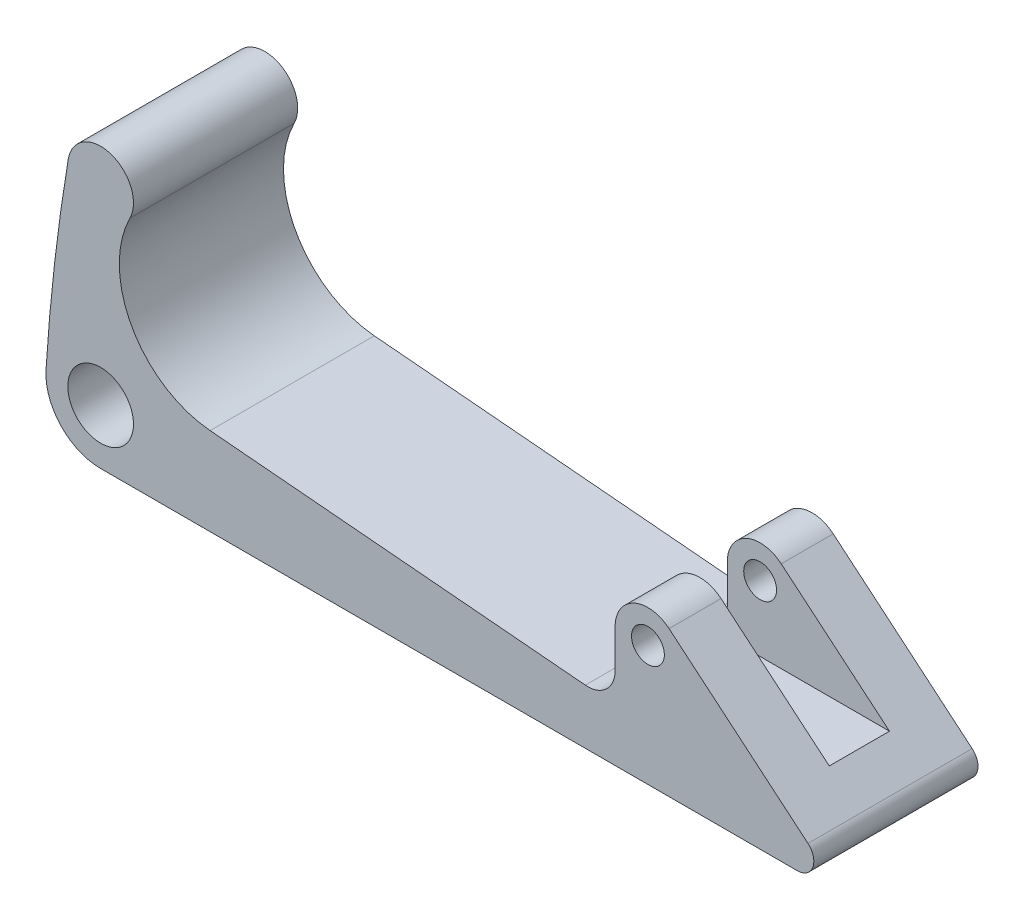
ISO-10303-21;
HEADER;
FILE_DESCRIPTION(('STEP AP214'),'2;1');
FILE_NAME('part.step','',(''),(''),'','','');
FILE_SCHEMA(('AUTOMOTIVE_DESIGN { 1 0 10303 214 1 1 1 1 }'));
ENDSEC;
DATA;
#1=APPLICATION_CONTEXT('core data for automotive mechanical design processes');
#2=APPLICATION_PROTOCOL_DEFINITION('international standard','automotive_design',2000,#1);
#3=PRODUCT_CONTEXT('',#1,'mechanical');
#4=PRODUCT('Part','Part','',(#3));
#5=PRODUCT_RELATED_PRODUCT_CATEGORY('part','',(#4));
#6=PRODUCT_DEFINITION_FORMATION('','',#4);
#7=PRODUCT_DEFINITION_CONTEXT('part definition',#1,'design');
#8=PRODUCT_DEFINITION('design','',#6,#7);
#9=PRODUCT_DEFINITION_SHAPE('','',#8);
#10=(LENGTH_UNIT() NAMED_UNIT(*) SI_UNIT(.MILLI.,.METRE.));
#11=(NAMED_UNIT(*) PLANE_ANGLE_UNIT() SI_UNIT($,.RADIAN.));
#12=(NAMED_UNIT(*) SI_UNIT($,.STERADIAN.) SOLID_ANGLE_UNIT());
#13=UNCERTAINTY_MEASURE_WITH_UNIT(LENGTH_MEASURE(1.E-05),#10,'distance_accuracy_value','');
#14=(GEOMETRIC_REPRESENTATION_CONTEXT(3) GLOBAL_UNCERTAINTY_ASSIGNED_CONTEXT((#13)) GLOBAL_UNIT_ASSIGNED_CONTEXT((#10,
#11,#12)) REPRESENTATION_CONTEXT('',''));
#15=CARTESIAN_POINT('',(0.,0.,0.));
#16=DIRECTION('',(0.,0.,1.));
#17=DIRECTION('',(1.,0.,0.));
#18=AXIS2_PLACEMENT_3D('',#15,#16,#17);
#19=CARTESIAN_POINT('',(64.6194262844656,-2.35093333532153,7.5));
#20=DIRECTION('',(-0.642787609686535,-0.766044443118982,0.));
#21=DIRECTION('',(0.766044443118982,-0.642787609686535,0.));
#22=AXIS2_PLACEMENT_3D('',#19,#20,#21);
#23=PLANE('',#22);
#24=DIRECTION('',(-0.766044443118982,0.642787609686535,0.));
#25=VECTOR('',#24,1.);
#26=CARTESIAN_POINT('',(41.4326190039493,17.1051081019381,2.75));
#27=LINE('',#26,#25);
#28=CARTESIAN_POINT('',(61.8176930361466,0.,2.75));
#29=VERTEX_POINT('',#28);
#30=CARTESIAN_POINT('',(51.9283628290596,8.29813332935695,2.75));
#31=VERTEX_POINT('',#30);
#32=EDGE_CURVE('E339',#29,#31,#27,.T.);
#33=ORIENTED_EDGE('',*,*,#32,.T.);
#34=DIRECTION('',(0.,0.,-1.));
#35=VECTOR('',#34,1.);
#36=CARTESIAN_POINT('',(51.9283628290596,8.29813332935695,7.5));
#37=LINE('',#36,#35);
#38=CARTESIAN_POINT('',(51.9283628290596,8.29813332935695,7.5));
#39=VERTEX_POINT('',#38);
#40=EDGE_CURVE('E211',#39,#31,#37,.T.);
#41=ORIENTED_EDGE('',*,*,#40,.F.);
#42=DIRECTION('',(-0.766044443118982,0.642787609686535,0.));
#43=VECTOR('',#42,1.);
#44=CARTESIAN_POINT('',(64.6194262844656,-2.35093333532153,7.5));
#45=LINE('',#44,#43);
#46=CARTESIAN_POINT('',(64.6194262844656,-2.35093333532153,7.5));
#47=VERTEX_POINT('',#46);
#48=EDGE_CURVE('E297',#47,#39,#45,.T.);
#49=ORIENTED_EDGE('',*,*,#48,.F.);
#50=DIRECTION('',(0.,0.,-1.));
#51=VECTOR('',#50,1.);
#52=CARTESIAN_POINT('',(64.6194262844656,-2.35093333532153,7.5));
#53=LINE('',#52,#51);
#54=CARTESIAN_POINT('',(64.6194262844656,-2.35093333532153,-7.5));
#55=VERTEX_POINT('',#54);
#56=EDGE_CURVE('E214',#47,#55,#53,.T.);
#57=ORIENTED_EDGE('',*,*,#56,.T.);
#58=DIRECTION('',(-0.766044443118982,0.642787609686535,0.));
#59=VECTOR('',#58,1.);
#60=CARTESIAN_POINT('',(64.6194262844656,-2.35093333532153,-7.5));
#61=LINE('',#60,#59);
#62=CARTESIAN_POINT('',(51.9283628290596,8.29813332935695,-7.5));
#63=VERTEX_POINT('',#62);
#64=EDGE_CURVE('E238',#55,#63,#61,.T.);
#65=ORIENTED_EDGE('',*,*,#64,.T.);
#66=CARTESIAN_POINT('',(51.9283628290596,8.29813332935695,-2.75));
#67=VERTEX_POINT('',#66);
#68=EDGE_CURVE('E210',#67,#63,#37,.T.);
#69=ORIENTED_EDGE('',*,*,#68,.F.);
#70=DIRECTION('',(-0.766044443118982,0.642787609686535,0.));
#71=VECTOR('',#70,1.);
#72=CARTESIAN_POINT('',(41.4326190039493,17.1051081019381,-2.75));
#73=LINE('',#72,#71);
#74=CARTESIAN_POINT('',(61.8176930361466,0.,-2.75));
#75=VERTEX_POINT('',#74);
#76=EDGE_CURVE('E321',#75,#67,#73,.T.);
#77=ORIENTED_EDGE('',*,*,#76,.F.);
#78=DIRECTION('',(0.,0.,1.));
#79=VECTOR('',#78,1.);
#80=CARTESIAN_POINT('',(61.8176930361466,0.,0.));
#81=LINE('',#80,#79);
#82=EDGE_CURVE('E330',#75,#29,#81,.T.);
#83=ORIENTED_EDGE('',*,*,#82,.T.);
#84=EDGE_LOOP('',(#33,#41,#49,#57,#65,#69,#77,#83));
#85=FACE_BOUND('',#84,.T.);
#86=ADVANCED_FACE('F34',(#85),#23,.F.);
#87=CARTESIAN_POINT('',(50.,6.,7.5));
#88=DIRECTION('',(0.,0.,-1.));
#89=DIRECTION('',(-1.,0.,0.));
#90=AXIS2_PLACEMENT_3D('',#87,#88,#89);
#91=CYLINDRICAL_SURFACE('',#90,3.);
#92=CARTESIAN_POINT('',(50.,6.,2.75));
#93=DIRECTION('',(0.,0.,-1.));
#94=DIRECTION('',(-1.,0.,0.));
#95=AXIS2_PLACEMENT_3D('',#92,#93,#94);
#96=CIRCLE('',#95,3.);
#97=CARTESIAN_POINT('',(47.,6.,2.75));
#98=VERTEX_POINT('',#97);
#99=EDGE_CURVE('E336',#31,#98,#96,.F.);
#100=ORIENTED_EDGE('',*,*,#99,.T.);
#101=DIRECTION('',(0.,0.,-1.));
#102=VECTOR('',#101,1.);
#103=CARTESIAN_POINT('',(47.,6.,7.5));
#104=LINE('',#103,#102);
#105=CARTESIAN_POINT('',(47.,6.,7.5));
#106=VERTEX_POINT('',#105);
#107=EDGE_CURVE('E207',#106,#98,#104,.T.);
#108=ORIENTED_EDGE('',*,*,#107,.F.);
#109=CARTESIAN_POINT('',(50.,6.,7.5));
#110=DIRECTION('',(0.,0.,1.));
#111=DIRECTION('',(1.,0.,0.));
#112=AXIS2_PLACEMENT_3D('',#109,#110,#111);
#113=CIRCLE('',#112,3.);
#114=EDGE_CURVE('E299',#39,#106,#113,.T.);
#115=ORIENTED_EDGE('',*,*,#114,.F.);
#116=ORIENTED_EDGE('',*,*,#40,.T.);
#117=EDGE_LOOP('',(#100,#108,#115,#116));
#118=FACE_BOUND('',#117,.T.);
#119=ADVANCED_FACE('F394',(#118),#91,.T.);
#120=CARTESIAN_POINT('',(47.,6.,7.5));
#121=DIRECTION('',(1.,0.,0.));
#122=DIRECTION('',(0.,1.,0.));
#123=AXIS2_PLACEMENT_3D('',#120,#121,#122);
#124=PLANE('',#123);
#125=DIRECTION('',(0.,-1.,0.));
#126=VECTOR('',#125,1.);
#127=CARTESIAN_POINT('',(47.,20.501,2.75));
#128=LINE('',#127,#126);
#129=CARTESIAN_POINT('',(47.,2.49119070221423,2.75));
#130=VERTEX_POINT('',#129);
#131=EDGE_CURVE('E340',#98,#130,#128,.T.);
#132=ORIENTED_EDGE('',*,*,#131,.T.);
#133=DIRECTION('',(0.,0.,-1.));
#134=VECTOR('',#133,1.);
#135=CARTESIAN_POINT('',(47.,2.49119070221423,7.5));
#136=LINE('',#135,#134);
#137=CARTESIAN_POINT('',(47.,2.49119070221423,7.5));
#138=VERTEX_POINT('',#137);
#139=EDGE_CURVE('E199',#138,#130,#136,.T.);
#140=ORIENTED_EDGE('',*,*,#139,.F.);
#141=DIRECTION('',(0.,-1.,0.));
#142=VECTOR('',#141,1.);
#143=CARTESIAN_POINT('',(47.,6.,7.5));
#144=LINE('',#143,#142);
#145=EDGE_CURVE('E301',#106,#138,#144,.T.);
#146=ORIENTED_EDGE('',*,*,#145,.F.);
#147=ORIENTED_EDGE('',*,*,#107,.T.);
#148=EDGE_LOOP('',(#132,#140,#146,#147));
#149=FACE_BOUND('',#148,.T.);
#150=ADVANCED_FACE('F399',(#149),#124,.F.);
#151=CARTESIAN_POINT('',(44.5,2.49119070221423,7.5));
#152=DIRECTION('',(0.,0.,-1.));
#153=DIRECTION('',(-1.,0.,0.));
#154=AXIS2_PLACEMENT_3D('',#151,#152,#153);
#155=CYLINDRICAL_SURFACE('',#154,2.5);
#156=DIRECTION('',(0.,0.,-1.));
#157=VECTOR('',#156,1.);
#158=CARTESIAN_POINT('',(44.2821106431309,0.000703956984865386,7.5));
#159=LINE('',#158,#157);
#160=CARTESIAN_POINT('',(44.2821106431309,0.000703956984865386,-2.75));
#161=VERTEX_POINT('',#160);
#162=CARTESIAN_POINT('',(44.2821106431309,0.000703956984865386,-7.5));
#163=VERTEX_POINT('',#162);
#164=EDGE_CURVE('E197',#161,#163,#159,.T.);
#165=ORIENTED_EDGE('',*,*,#164,.F.);
#166=CARTESIAN_POINT('',(44.5,2.49119070221423,-2.75));
#167=DIRECTION('',(0.,0.,-1.));
#168=DIRECTION('',(-1.,0.,0.));
#169=AXIS2_PLACEMENT_3D('',#166,#167,#168);
#170=CIRCLE('',#169,2.5);
#171=CARTESIAN_POINT('',(44.2903124104736,0.,-2.75));
#172=VERTEX_POINT('',#171);
#173=EDGE_CURVE('E170',#172,#161,#170,.T.);
#174=ORIENTED_EDGE('',*,*,#173,.F.);
#175=DIRECTION('',(0.,0.,-1.));
#176=VECTOR('',#175,1.);
#177=CARTESIAN_POINT('',(44.2903124104736,0.,7.5));
#178=LINE('',#177,#176);
#179=CARTESIAN_POINT('',(44.2903124104736,0.,2.75));
#180=VERTEX_POINT('',#179);
#181=EDGE_CURVE('E180',#172,#180,#178,.F.);
#182=ORIENTED_EDGE('',*,*,#181,.T.);
#183=CARTESIAN_POINT('',(44.5,2.49119070221423,2.75));
#184=DIRECTION('',(0.,0.,-1.));
#185=DIRECTION('',(-1.,0.,0.));
#186=AXIS2_PLACEMENT_3D('',#183,#184,#185);
#187=CIRCLE('',#186,2.5);
#188=CARTESIAN_POINT('',(44.2821106431309,0.000703956984865386,2.75));
#189=VERTEX_POINT('',#188);
#190=EDGE_CURVE('E176',#180,#189,#187,.T.);
#191=ORIENTED_EDGE('',*,*,#190,.T.);
#192=CARTESIAN_POINT('',(44.2821106431309,0.000703956984865386,7.5));
#193=VERTEX_POINT('',#192);
#194=EDGE_CURVE('E188',#193,#189,#159,.T.);
#195=ORIENTED_EDGE('',*,*,#194,.F.);
#196=CARTESIAN_POINT('',(44.5,2.49119070221423,7.5));
#197=DIRECTION('',(0.,0.,-1.));
#198=DIRECTION('',(-1.,0.,0.));
#199=AXIS2_PLACEMENT_3D('',#196,#197,#198);
#200=CIRCLE('',#199,2.5);
#201=EDGE_CURVE('E303',#138,#193,#200,.T.);
#202=ORIENTED_EDGE('',*,*,#201,.F.);
#203=ORIENTED_EDGE('',*,*,#139,.T.);
#204=CARTESIAN_POINT('',(44.5,2.49119070221423,2.75));
#205=DIRECTION('',(0.,0.,-1.));
#206=DIRECTION('',(-1.,0.,0.));
#207=AXIS2_PLACEMENT_3D('',#204,#205,#206);
#208=CIRCLE('',#207,2.5);
#209=CARTESIAN_POINT('',(44.7096875895264,0.,2.75));
#210=VERTEX_POINT('',#209);
#211=EDGE_CURVE('E329',#130,#210,#208,.T.);
#212=ORIENTED_EDGE('',*,*,#211,.T.);
#213=DIRECTION('',(0.,0.,-1.));
#214=VECTOR('',#213,1.);
#215=CARTESIAN_POINT('',(44.7096875895264,0.,7.5));
#216=LINE('',#215,#214);
#217=CARTESIAN_POINT('',(44.7096875895264,0.,-2.75));
#218=VERTEX_POINT('',#217);
#219=EDGE_CURVE('E333',#210,#218,#216,.T.);
#220=ORIENTED_EDGE('',*,*,#219,.T.);
#221=CARTESIAN_POINT('',(44.5,2.49119070221423,-2.75));
#222=DIRECTION('',(0.,0.,-1.));
#223=DIRECTION('',(-1.,0.,0.));
#224=AXIS2_PLACEMENT_3D('',#221,#222,#223);
#225=CIRCLE('',#224,2.5);
#226=CARTESIAN_POINT('',(47.,2.49119070221423,-2.75));
#227=VERTEX_POINT('',#226);
#228=EDGE_CURVE('E325',#227,#218,#225,.T.);
#229=ORIENTED_EDGE('',*,*,#228,.F.);
#230=CARTESIAN_POINT('',(47.,2.49119070221423,-7.5));
#231=VERTEX_POINT('',#230);
#232=EDGE_CURVE('E196',#227,#231,#136,.T.);
#233=ORIENTED_EDGE('',*,*,#232,.T.);
#234=CARTESIAN_POINT('',(44.5,2.49119070221423,-7.5));
#235=DIRECTION('',(0.,0.,-1.));
#236=DIRECTION('',(-1.,0.,0.));
#237=AXIS2_PLACEMENT_3D('',#234,#235,#236);
#238=CIRCLE('',#237,2.5);
#239=EDGE_CURVE('E252',#231,#163,#238,.T.);
#240=ORIENTED_EDGE('',*,*,#239,.T.);
#241=EDGE_LOOP('',(#165,#174,#182,#191,#195,#202,#203,#212,#220,#229,#233,#240));
#242=FACE_BOUND('',#241,.T.);
#243=ADVANCED_FACE('F186',(#242),#155,.F.);
#244=CARTESIAN_POINT('',(50.,6.,7.5));
#245=DIRECTION('',(0.,0.,-1.));
#246=DIRECTION('',(-1.,0.,0.));
#247=AXIS2_PLACEMENT_3D('',#244,#245,#246);
#248=CYLINDRICAL_SURFACE('',#247,1.5);
#249=CARTESIAN_POINT('',(50.,6.,7.5));
#250=DIRECTION('',(0.,0.,1.));
#251=DIRECTION('',(1.,0.,0.));
#252=AXIS2_PLACEMENT_3D('',#249,#250,#251);
#253=CIRCLE('',#252,1.5);
#254=CARTESIAN_POINT('',(51.5,6.,7.5));
#255=VERTEX_POINT('',#254);
#256=EDGE_CURVE('E312',#255,#255,#253,.T.);
#257=ORIENTED_EDGE('',*,*,#256,.T.);
#258=EDGE_LOOP('',(#257));
#259=FACE_BOUND('',#258,.T.);
#260=CARTESIAN_POINT('',(50.,6.,2.75));
#261=DIRECTION('',(0.,0.,-1.));
#262=DIRECTION('',(-1.,0.,0.));
#263=AXIS2_PLACEMENT_3D('',#260,#261,#262);
#264=CIRCLE('',#263,1.5);
#265=CARTESIAN_POINT('',(48.5,6.,2.75));
#266=VERTEX_POINT('',#265);
#267=EDGE_CURVE('E322',#266,#266,#264,.F.);
#268=ORIENTED_EDGE('',*,*,#267,.F.);
#269=EDGE_LOOP('',(#268));
#270=FACE_BOUND('',#269,.T.);
#271=ADVANCED_FACE('F421',(#259,#270),#248,.F.);
#272=CARTESIAN_POINT('',(164.683096879914,-10.2214285714286,7.5));
#273=DIRECTION('',(0.,0.,-1.));
#274=DIRECTION('',(-1.,0.,0.));
#275=AXIS2_PLACEMENT_3D('',#272,#273,#274);
#276=PLANE('',#275);
#277=CARTESIAN_POINT('',(164.683096879914,-10.2214285714286,7.5));
#278=DIRECTION('',(0.,0.,1.));
#279=DIRECTION('',(-1.,0.,0.));
#280=AXIS2_PLACEMENT_3D('',#277,#278,#279);
#281=CIRCLE('',#280,170.);
#282=CARTESIAN_POINT('',(-2.95837898586672,17.9979897348161,7.5));
#283=VERTEX_POINT('',#282);
#284=CARTESIAN_POINT('',(-4.9903968751489,0.30974025974026,7.5));
#285=VERTEX_POINT('',#284);
#286=EDGE_CURVE('E261',#283,#285,#281,.T.);
#287=ORIENTED_EDGE('',*,*,#286,.T.);
#288=CARTESIAN_POINT('',(0.,0.,7.5));
#289=DIRECTION('',(0.,0.,1.));
#290=DIRECTION('',(-1.,0.,0.));
#291=AXIS2_PLACEMENT_3D('',#288,#289,#290);
#292=CIRCLE('',#291,4.99999999999999);
#293=CARTESIAN_POINT('',(0.,-5.,7.5));
#294=VERTEX_POINT('',#293);
#295=EDGE_CURVE('E287',#285,#294,#292,.T.);
#296=ORIENTED_EDGE('',*,*,#295,.T.);
#297=DIRECTION('',(1.,0.,0.));
#298=VECTOR('',#297,1.);
#299=CARTESIAN_POINT('',(0.,-5.,7.5));
#300=LINE('',#299,#298);
#301=CARTESIAN_POINT('',(63.6552448699358,-5.,7.5));
#302=VERTEX_POINT('',#301);
#303=EDGE_CURVE('E227',#294,#302,#300,.T.);
#304=ORIENTED_EDGE('',*,*,#303,.T.);
#305=CARTESIAN_POINT('',(63.6552448699358,-3.5,7.5));
#306=DIRECTION('',(0.,0.,1.));
#307=DIRECTION('',(1.,0.,0.));
#308=AXIS2_PLACEMENT_3D('',#305,#306,#307);
#309=CIRCLE('',#308,1.5);
#310=EDGE_CURVE('E295',#302,#47,#309,.T.);
#311=ORIENTED_EDGE('',*,*,#310,.T.);
#312=ORIENTED_EDGE('',*,*,#48,.T.);
#313=ORIENTED_EDGE('',*,*,#114,.T.);
#314=ORIENTED_EDGE('',*,*,#145,.T.);
#315=ORIENTED_EDGE('',*,*,#201,.T.);
#316=DIRECTION('',(-0.996194698091746,0.0871557427476512,0.));
#317=VECTOR('',#316,1.);
#318=CARTESIAN_POINT('',(44.2821106431309,0.000703956984865386,7.5));
#319=LINE('',#318,#317);
#320=CARTESIAN_POINT('',(10.,3.,7.5));
#321=VERTEX_POINT('',#320);
#322=EDGE_CURVE('E195',#193,#321,#319,.T.);
#323=ORIENTED_EDGE('',*,*,#322,.T.);
#324=CARTESIAN_POINT('',(10.7921090503872,12.0538478754167,7.5));
#325=DIRECTION('',(0.,0.,-1.));
#326=DIRECTION('',(1.,0.,0.));
#327=AXIS2_PLACEMENT_3D('',#324,#325,#326);
#328=CIRCLE('',#327,9.088432103443);
#329=CARTESIAN_POINT('',(2.67829002753302,16.1484222077819,7.5));
#330=VERTEX_POINT('',#329);
#331=EDGE_CURVE('E276',#321,#330,#328,.T.);
#332=ORIENTED_EDGE('',*,*,#331,.T.);
#333=CARTESIAN_POINT('',(0.,17.5,7.5));
#334=DIRECTION('',(0.,0.,1.));
#335=DIRECTION('',(-1.,0.,0.));
#336=AXIS2_PLACEMENT_3D('',#333,#334,#335);
#337=CIRCLE('',#336,2.99999999999999);
#338=EDGE_CURVE('E265',#330,#283,#337,.T.);
#339=ORIENTED_EDGE('',*,*,#338,.T.);
#340=EDGE_LOOP('',(#287,#296,#304,#311,#312,#313,#314,#315,#323,#332,#339));
#341=FACE_BOUND('',#340,.T.);
#342=CARTESIAN_POINT('',(0.,0.,7.5));
#343=DIRECTION('',(0.,0.,1.));
#344=DIRECTION('',(1.,0.,0.));
#345=AXIS2_PLACEMENT_3D('',#342,#343,#344);
#346=CIRCLE('',#345,3.);
#347=CARTESIAN_POINT('',(3.,0.,7.5));
#348=VERTEX_POINT('',#347);
#349=EDGE_CURVE('E307',#348,#348,#346,.T.);
#350=ORIENTED_EDGE('',*,*,#349,.F.);
#351=EDGE_LOOP('',(#350));
#352=FACE_BOUND('',#351,.T.);
#353=ORIENTED_EDGE('',*,*,#256,.F.);
#354=EDGE_LOOP('',(#353));
#355=FACE_BOUND('',#354,.T.);
#356=ADVANCED_FACE('F384',(#341,#352,#355),#276,.F.);
#357=CARTESIAN_POINT('',(164.683096879914,-10.2214285714286,-7.5));
#358=DIRECTION('',(0.,0.,-1.));
#359=DIRECTION('',(-1.,0.,0.));
#360=AXIS2_PLACEMENT_3D('',#357,#358,#359);
#361=PLANE('',#360);
#362=CARTESIAN_POINT('',(0.,0.,-7.5));
#363=DIRECTION('',(0.,0.,1.));
#364=DIRECTION('',(1.,0.,0.));
#365=AXIS2_PLACEMENT_3D('',#362,#363,#364);
#366=CIRCLE('',#365,3.);
#367=CARTESIAN_POINT('',(3.,0.,-7.5));
#368=VERTEX_POINT('',#367);
#369=EDGE_CURVE('E291',#368,#368,#366,.T.);
#370=ORIENTED_EDGE('',*,*,#369,.T.);
#371=EDGE_LOOP('',(#370));
#372=FACE_BOUND('',#371,.T.);
#373=CARTESIAN_POINT('',(164.683096879914,-10.2214285714286,-7.5));
#374=DIRECTION('',(0.,0.,1.));
#375=DIRECTION('',(-1.,0.,0.));
#376=AXIS2_PLACEMENT_3D('',#373,#374,#375);
#377=CIRCLE('',#376,170.);
#378=CARTESIAN_POINT('',(-2.95837898586672,17.9979897348161,-7.5));
#379=VERTEX_POINT('',#378);
#380=CARTESIAN_POINT('',(-4.9903968751489,0.30974025974026,-7.5));
#381=VERTEX_POINT('',#380);
#382=EDGE_CURVE('E240',#379,#381,#377,.T.);
#383=ORIENTED_EDGE('',*,*,#382,.F.);
#384=CARTESIAN_POINT('',(0.,17.5,-7.5));
#385=DIRECTION('',(0.,0.,1.));
#386=DIRECTION('',(-1.,0.,0.));
#387=AXIS2_PLACEMENT_3D('',#384,#385,#386);
#388=CIRCLE('',#387,2.99999999999999);
#389=CARTESIAN_POINT('',(2.67829002753302,16.1484222077819,-7.5));
#390=VERTEX_POINT('',#389);
#391=EDGE_CURVE('E259',#390,#379,#388,.T.);
#392=ORIENTED_EDGE('',*,*,#391,.F.);
#393=CARTESIAN_POINT('',(10.7921090503872,12.0538478754167,-7.5));
#394=DIRECTION('',(0.,0.,-1.));
#395=DIRECTION('',(1.,0.,0.));
#396=AXIS2_PLACEMENT_3D('',#393,#394,#395);
#397=CIRCLE('',#396,9.088432103443);
#398=CARTESIAN_POINT('',(10.,3.,-7.5));
#399=VERTEX_POINT('',#398);
#400=EDGE_CURVE('E257',#399,#390,#397,.T.);
#401=ORIENTED_EDGE('',*,*,#400,.F.);
#402=DIRECTION('',(-0.996194698091746,0.0871557427476512,0.));
#403=VECTOR('',#402,1.);
#404=CARTESIAN_POINT('',(44.2821106431309,0.000703956984865386,-7.5));
#405=LINE('',#404,#403);
#406=EDGE_CURVE('E255',#163,#399,#405,.T.);
#407=ORIENTED_EDGE('',*,*,#406,.F.);
#408=ORIENTED_EDGE('',*,*,#239,.F.);
#409=DIRECTION('',(0.,-1.,0.));
#410=VECTOR('',#409,1.);
#411=CARTESIAN_POINT('',(47.,6.,-7.5));
#412=LINE('',#411,#410);
#413=CARTESIAN_POINT('',(47.,6.,-7.5));
#414=VERTEX_POINT('',#413);
#415=EDGE_CURVE('E249',#414,#231,#412,.T.);
#416=ORIENTED_EDGE('',*,*,#415,.F.);
#417=CARTESIAN_POINT('',(50.,6.,-7.5));
#418=DIRECTION('',(0.,0.,1.));
#419=DIRECTION('',(1.,0.,0.));
#420=AXIS2_PLACEMENT_3D('',#417,#418,#419);
#421=CIRCLE('',#420,3.);
#422=EDGE_CURVE('E246',#63,#414,#421,.T.);
#423=ORIENTED_EDGE('',*,*,#422,.F.);
#424=ORIENTED_EDGE('',*,*,#64,.F.);
#425=CARTESIAN_POINT('',(63.6552448699358,-3.5,-7.5));
#426=DIRECTION('',(0.,0.,1.));
#427=DIRECTION('',(1.,0.,0.));
#428=AXIS2_PLACEMENT_3D('',#425,#426,#427);
#429=CIRCLE('',#428,1.5);
#430=CARTESIAN_POINT('',(63.6552448699358,-5.,-7.5));
#431=VERTEX_POINT('',#430);
#432=EDGE_CURVE('E236',#431,#55,#429,.T.);
#433=ORIENTED_EDGE('',*,*,#432,.F.);
#434=DIRECTION('',(1.,0.,0.));
#435=VECTOR('',#434,1.);
#436=CARTESIAN_POINT('',(0.,-5.,-7.5));
#437=LINE('',#436,#435);
#438=CARTESIAN_POINT('',(0.,-5.,-7.5));
#439=VERTEX_POINT('',#438);
#440=EDGE_CURVE('E226',#439,#431,#437,.T.);
#441=ORIENTED_EDGE('',*,*,#440,.F.);
#442=CARTESIAN_POINT('',(0.,0.,-7.5));
#443=DIRECTION('',(0.,0.,1.));
#444=DIRECTION('',(-1.,0.,0.));
#445=AXIS2_PLACEMENT_3D('',#442,#443,#444);
#446=CIRCLE('',#445,4.99999999999999);
#447=EDGE_CURVE('E234',#381,#439,#446,.T.);
#448=ORIENTED_EDGE('',*,*,#447,.F.);
#449=EDGE_LOOP('',(#383,#392,#401,#407,#408,#416,#423,#424,#433,#441,#448));
#450=FACE_BOUND('',#449,.T.);
#451=CARTESIAN_POINT('',(50.,6.,-7.5));
#452=DIRECTION('',(0.,0.,1.));
#453=DIRECTION('',(1.,0.,0.));
#454=AXIS2_PLACEMENT_3D('',#451,#452,#453);
#455=CIRCLE('',#454,1.5);
#456=CARTESIAN_POINT('',(51.5,6.,-7.5));
#457=VERTEX_POINT('',#456);
#458=EDGE_CURVE('E314',#457,#457,#455,.T.);
#459=ORIENTED_EDGE('',*,*,#458,.T.);
#460=EDGE_LOOP('',(#459));
#461=FACE_BOUND('',#460,.T.);
#462=ADVANCED_FACE('F232',(#372,#450,#461),#361,.T.);
#463=CARTESIAN_POINT('',(164.683096879914,-10.2214285714286,7.5));
#464=DIRECTION('',(0.,0.,-1.));
#465=DIRECTION('',(-1.,0.,0.));
#466=AXIS2_PLACEMENT_3D('',#463,#464,#465);
#467=CYLINDRICAL_SURFACE('',#466,170.);
#468=ORIENTED_EDGE('',*,*,#382,.T.);
#469=DIRECTION('',(0.,0.,-1.));
#470=VECTOR('',#469,1.);
#471=CARTESIAN_POINT('',(-4.9903968751489,0.30974025974026,7.5));
#472=LINE('',#471,#470);
#473=EDGE_CURVE('E11',#285,#381,#472,.T.);
#474=ORIENTED_EDGE('',*,*,#473,.F.);
#475=ORIENTED_EDGE('',*,*,#286,.F.);
#476=DIRECTION('',(0.,0.,-1.));
#477=VECTOR('',#476,1.);
#478=CARTESIAN_POINT('',(-2.95837898586672,17.9979897348161,7.5));
#479=LINE('',#478,#477);
#480=EDGE_CURVE('E262',#283,#379,#479,.T.);
#481=ORIENTED_EDGE('',*,*,#480,.T.);
#482=EDGE_LOOP('',(#468,#474,#475,#481));
#483=FACE_BOUND('',#482,.T.);
#484=ADVANCED_FACE('F36',(#483),#467,.T.);
#485=CARTESIAN_POINT('',(0.,0.,7.5));
#486=DIRECTION('',(0.,0.,-1.));
#487=DIRECTION('',(-1.,0.,0.));
#488=AXIS2_PLACEMENT_3D('',#485,#486,#487);
#489=CYLINDRICAL_SURFACE('',#488,4.99999999999999);
#490=ORIENTED_EDGE('',*,*,#447,.T.);
#491=DIRECTION('',(0.,0.,-1.));
#492=VECTOR('',#491,1.);
#493=CARTESIAN_POINT('',(0.,-5.,7.5));
#494=LINE('',#493,#492);
#495=EDGE_CURVE('E42',#294,#439,#494,.T.);
#496=ORIENTED_EDGE('',*,*,#495,.F.);
#497=ORIENTED_EDGE('',*,*,#295,.F.);
#498=ORIENTED_EDGE('',*,*,#473,.T.);
#499=EDGE_LOOP('',(#490,#496,#497,#498));
#500=FACE_BOUND('',#499,.T.);
#501=ADVANCED_FACE('F386',(#500),#489,.T.);
#502=CARTESIAN_POINT('',(0.,-5.,7.5));
#503=DIRECTION('',(0.,1.,0.));
#504=DIRECTION('',(-1.,0.,0.));
#505=AXIS2_PLACEMENT_3D('',#502,#503,#504);
#506=PLANE('',#505);
#507=ORIENTED_EDGE('',*,*,#440,.T.);
#508=DIRECTION('',(0.,0.,-1.));
#509=VECTOR('',#508,1.);
#510=CARTESIAN_POINT('',(63.6552448699358,-5.,7.5));
#511=LINE('',#510,#509);
#512=EDGE_CURVE('E217',#302,#431,#511,.T.);
#513=ORIENTED_EDGE('',*,*,#512,.F.);
#514=ORIENTED_EDGE('',*,*,#303,.F.);
#515=ORIENTED_EDGE('',*,*,#495,.T.);
#516=EDGE_LOOP('',(#507,#513,#514,#515));
#517=FACE_BOUND('',#516,.T.);
#518=ADVANCED_FACE('F224',(#517),#506,.F.);
#519=CARTESIAN_POINT('',(63.6552448699358,-3.5,7.5));
#520=DIRECTION('',(0.,0.,-1.));
#521=DIRECTION('',(-1.,0.,0.));
#522=AXIS2_PLACEMENT_3D('',#519,#520,#521);
#523=CYLINDRICAL_SURFACE('',#522,1.5);
#524=ORIENTED_EDGE('',*,*,#432,.T.);
#525=ORIENTED_EDGE('',*,*,#56,.F.);
#526=ORIENTED_EDGE('',*,*,#310,.F.);
#527=ORIENTED_EDGE('',*,*,#512,.T.);
#528=EDGE_LOOP('',(#524,#525,#526,#527));
#529=FACE_BOUND('',#528,.T.);
#530=ADVANCED_FACE('F383',(#529),#523,.T.);
#531=CARTESIAN_POINT('',(47.,6.,-2.75));
#532=VERTEX_POINT('',#531);
#533=EDGE_CURVE('E206',#532,#414,#104,.T.);
#534=ORIENTED_EDGE('',*,*,#533,.F.);
#535=CARTESIAN_POINT('',(50.,6.,-2.75));
#536=DIRECTION('',(0.,0.,-1.));
#537=DIRECTION('',(-1.,0.,0.));
#538=AXIS2_PLACEMENT_3D('',#535,#536,#537);
#539=CIRCLE('',#538,3.);
#540=EDGE_CURVE('E319',#67,#532,#539,.F.);
#541=ORIENTED_EDGE('',*,*,#540,.F.);
#542=ORIENTED_EDGE('',*,*,#68,.T.);
#543=ORIENTED_EDGE('',*,*,#422,.T.);
#544=EDGE_LOOP('',(#534,#541,#542,#543));
#545=FACE_BOUND('',#544,.T.);
#546=ADVANCED_FACE('F374',(#545),#91,.T.);
#547=ORIENTED_EDGE('',*,*,#232,.F.);
#548=DIRECTION('',(0.,-1.,0.));
#549=VECTOR('',#548,1.);
#550=CARTESIAN_POINT('',(47.,20.501,-2.75));
#551=LINE('',#550,#549);
#552=EDGE_CURVE('E323',#532,#227,#551,.T.);
#553=ORIENTED_EDGE('',*,*,#552,.F.);
#554=ORIENTED_EDGE('',*,*,#533,.T.);
#555=ORIENTED_EDGE('',*,*,#415,.T.);
#556=EDGE_LOOP('',(#547,#553,#554,#555));
#557=FACE_BOUND('',#556,.T.);
#558=ADVANCED_FACE('F369',(#557),#124,.F.);
#559=CARTESIAN_POINT('',(44.2821106431309,0.000703956984865386,7.5));
#560=DIRECTION('',(-0.0871557427476512,-0.996194698091746,0.));
#561=DIRECTION('',(0.996194698091746,-0.0871557427476512,0.));
#562=AXIS2_PLACEMENT_3D('',#559,#560,#561);
#563=PLANE('',#562);
#564=ORIENTED_EDGE('',*,*,#406,.T.);
#565=DIRECTION('',(0.,0.,-1.));
#566=VECTOR('',#565,1.);
#567=CARTESIAN_POINT('',(10.,3.,7.5));
#568=LINE('',#567,#566);
#569=EDGE_CURVE('E201',#321,#399,#568,.T.);
#570=ORIENTED_EDGE('',*,*,#569,.F.);
#571=ORIENTED_EDGE('',*,*,#322,.F.);
#572=ORIENTED_EDGE('',*,*,#194,.T.);
#573=DIRECTION('',(0.,0.,-1.));
#574=VECTOR('',#573,1.);
#575=CARTESIAN_POINT('',(44.2821106431309,0.000703956984865386,7.5));
#576=LINE('',#575,#574);
#577=EDGE_CURVE('E163',#189,#161,#576,.T.);
#578=ORIENTED_EDGE('',*,*,#577,.T.);
#579=ORIENTED_EDGE('',*,*,#164,.T.);
#580=EDGE_LOOP('',(#564,#570,#571,#572,#578,#579));
#581=FACE_BOUND('',#580,.T.);
#582=ADVANCED_FACE('F193',(#581),#563,.F.);
#583=CARTESIAN_POINT('',(10.7921090503872,12.0538478754167,7.5));
#584=DIRECTION('',(0.,0.,-1.));
#585=DIRECTION('',(-1.,0.,0.));
#586=AXIS2_PLACEMENT_3D('',#583,#584,#585);
#587=CYLINDRICAL_SURFACE('',#586,9.088432103443);
#588=ORIENTED_EDGE('',*,*,#400,.T.);
#589=DIRECTION('',(0.,0.,-1.));
#590=VECTOR('',#589,1.);
#591=CARTESIAN_POINT('',(2.67829002753302,16.1484222077819,7.5));
#592=LINE('',#591,#590);
#593=EDGE_CURVE('E264',#330,#390,#592,.T.);
#594=ORIENTED_EDGE('',*,*,#593,.F.);
#595=ORIENTED_EDGE('',*,*,#331,.F.);
#596=ORIENTED_EDGE('',*,*,#569,.T.);
#597=EDGE_LOOP('',(#588,#594,#595,#596));
#598=FACE_BOUND('',#597,.T.);
#599=ADVANCED_FACE('F275',(#598),#587,.F.);
#600=CARTESIAN_POINT('',(0.,17.5,7.5));
#601=DIRECTION('',(0.,0.,-1.));
#602=DIRECTION('',(-1.,0.,0.));
#603=AXIS2_PLACEMENT_3D('',#600,#601,#602);
#604=CYLINDRICAL_SURFACE('',#603,2.99999999999999);
#605=ORIENTED_EDGE('',*,*,#391,.T.);
#606=ORIENTED_EDGE('',*,*,#480,.F.);
#607=ORIENTED_EDGE('',*,*,#338,.F.);
#608=ORIENTED_EDGE('',*,*,#593,.T.);
#609=EDGE_LOOP('',(#605,#606,#607,#608));
#610=FACE_BOUND('',#609,.T.);
#611=ADVANCED_FACE('F281',(#610),#604,.T.);
#612=CARTESIAN_POINT('',(0.,0.,7.5));
#613=DIRECTION('',(0.,0.,-1.));
#614=DIRECTION('',(-1.,0.,0.));
#615=AXIS2_PLACEMENT_3D('',#612,#613,#614);
#616=CYLINDRICAL_SURFACE('',#615,3.);
#617=ORIENTED_EDGE('',*,*,#349,.T.);
#618=EDGE_LOOP('',(#617));
#619=FACE_BOUND('',#618,.T.);
#620=ORIENTED_EDGE('',*,*,#369,.F.);
#621=EDGE_LOOP('',(#620));
#622=FACE_BOUND('',#621,.T.);
#623=ADVANCED_FACE('F449',(#619,#622),#616,.F.);
#624=CARTESIAN_POINT('',(50.,6.,-2.75));
#625=DIRECTION('',(0.,0.,-1.));
#626=DIRECTION('',(-1.,0.,0.));
#627=AXIS2_PLACEMENT_3D('',#624,#625,#626);
#628=CIRCLE('',#627,1.5);
#629=CARTESIAN_POINT('',(48.5,6.,-2.75));
#630=VERTEX_POINT('',#629);
#631=EDGE_CURVE('E326',#630,#630,#628,.F.);
#632=ORIENTED_EDGE('',*,*,#631,.T.);
#633=EDGE_LOOP('',(#632));
#634=FACE_BOUND('',#633,.T.);
#635=ORIENTED_EDGE('',*,*,#458,.F.);
#636=EDGE_LOOP('',(#635));
#637=FACE_BOUND('',#636,.T.);
#638=ADVANCED_FACE('F441',(#634,#637),#248,.F.);
#639=CARTESIAN_POINT('',(44.2821106431309,20.501,2.75));
#640=DIRECTION('',(0.,0.,-1.));
#641=DIRECTION('',(-1.,0.,0.));
#642=AXIS2_PLACEMENT_3D('',#639,#640,#641);
#643=PLANE('',#642);
#644=ORIENTED_EDGE('',*,*,#267,.T.);
#645=EDGE_LOOP('',(#644));
#646=FACE_BOUND('',#645,.T.);
#647=DIRECTION('',(1.,0.,0.));
#648=VECTOR('',#647,1.);
#649=CARTESIAN_POINT('',(44.2821106431309,0.,2.75));
#650=LINE('',#649,#648);
#651=EDGE_CURVE('E171',#210,#29,#650,.T.);
#652=ORIENTED_EDGE('',*,*,#651,.F.);
#653=ORIENTED_EDGE('',*,*,#211,.F.);
#654=ORIENTED_EDGE('',*,*,#131,.F.);
#655=ORIENTED_EDGE('',*,*,#99,.F.);
#656=ORIENTED_EDGE('',*,*,#32,.F.);
#657=EDGE_LOOP('',(#652,#653,#654,#655,#656));
#658=FACE_BOUND('',#657,.T.);
#659=ADVANCED_FACE('F428',(#646,#658),#643,.T.);
#660=CARTESIAN_POINT('',(44.2821106431309,20.501,-2.75));
#661=DIRECTION('',(0.,0.,-1.));
#662=DIRECTION('',(-1.,0.,0.));
#663=AXIS2_PLACEMENT_3D('',#660,#661,#662);
#664=PLANE('',#663);
#665=ORIENTED_EDGE('',*,*,#631,.F.);
#666=EDGE_LOOP('',(#665));
#667=FACE_BOUND('',#666,.T.);
#668=ORIENTED_EDGE('',*,*,#76,.T.);
#669=ORIENTED_EDGE('',*,*,#540,.T.);
#670=ORIENTED_EDGE('',*,*,#552,.T.);
#671=ORIENTED_EDGE('',*,*,#228,.T.);
#672=DIRECTION('',(1.,0.,0.));
#673=VECTOR('',#672,1.);
#674=CARTESIAN_POINT('',(44.2821106431309,0.,-2.75));
#675=LINE('',#674,#673);
#676=EDGE_CURVE('E49',#218,#75,#675,.T.);
#677=ORIENTED_EDGE('',*,*,#676,.T.);
#678=EDGE_LOOP('',(#668,#669,#670,#671,#677));
#679=FACE_BOUND('',#678,.T.);
#680=ADVANCED_FACE('F431',(#667,#679),#664,.F.);
#681=CARTESIAN_POINT('',(0.,0.,0.));
#682=DIRECTION('',(0.,1.,0.));
#683=DIRECTION('',(0.,0.,1.));
#684=AXIS2_PLACEMENT_3D('',#681,#682,#683);
#685=PLANE('',#684);
#686=ORIENTED_EDGE('',*,*,#676,.F.);
#687=ORIENTED_EDGE('',*,*,#219,.F.);
#688=ORIENTED_EDGE('',*,*,#651,.T.);
#689=ORIENTED_EDGE('',*,*,#82,.F.);
#690=EDGE_LOOP('',(#686,#687,#688,#689));
#691=FACE_BOUND('',#690,.T.);
#692=ADVANCED_FACE('F429',(#691),#685,.T.);
#693=CARTESIAN_POINT('',(0.,0.,0.));
#694=DIRECTION('',(0.,1.,0.));
#695=DIRECTION('',(0.,0.,1.));
#696=AXIS2_PLACEMENT_3D('',#693,#694,#695);
#697=PLANE('',#696);
#698=DIRECTION('',(1.,0.,0.));
#699=VECTOR('',#698,1.);
#700=CARTESIAN_POINT('',(44.2821106431309,0.,-2.75));
#701=LINE('',#700,#699);
#702=CARTESIAN_POINT('',(44.2821106431309,0.,-2.75));
#703=VERTEX_POINT('',#702);
#704=EDGE_CURVE('E356',#703,#172,#701,.T.);
#705=ORIENTED_EDGE('',*,*,#704,.F.);
#706=DIRECTION('',(0.,0.,1.));
#707=VECTOR('',#706,1.);
#708=CARTESIAN_POINT('',(44.2821106431309,0.,-2.75));
#709=LINE('',#708,#707);
#710=CARTESIAN_POINT('',(44.2821106431309,0.,2.75));
#711=VERTEX_POINT('',#710);
#712=EDGE_CURVE('E191',#703,#711,#709,.T.);
#713=ORIENTED_EDGE('',*,*,#712,.T.);
#714=DIRECTION('',(1.,0.,0.));
#715=VECTOR('',#714,1.);
#716=CARTESIAN_POINT('',(44.2821106431309,0.,2.75));
#717=LINE('',#716,#715);
#718=EDGE_CURVE('E178',#711,#180,#717,.T.);
#719=ORIENTED_EDGE('',*,*,#718,.T.);
#720=ORIENTED_EDGE('',*,*,#181,.F.);
#721=EDGE_LOOP('',(#705,#713,#719,#720));
#722=FACE_BOUND('',#721,.T.);
#723=ADVANCED_FACE('F439',(#722),#697,.T.);
#724=CARTESIAN_POINT('',(44.2821106431309,20.501,-2.75));
#725=DIRECTION('',(0.,0.,-1.));
#726=DIRECTION('',(-1.,0.,0.));
#727=AXIS2_PLACEMENT_3D('',#724,#725,#726);
#728=PLANE('',#727);
#729=ORIENTED_EDGE('',*,*,#173,.T.);
#730=DIRECTION('',(0.,-1.,0.));
#731=VECTOR('',#730,1.);
#732=CARTESIAN_POINT('',(44.2821106431309,20.501,-2.75));
#733=LINE('',#732,#731);
#734=EDGE_CURVE('E57',#161,#703,#733,.T.);
#735=ORIENTED_EDGE('',*,*,#734,.T.);
#736=ORIENTED_EDGE('',*,*,#704,.T.);
#737=EDGE_LOOP('',(#729,#735,#736));
#738=FACE_BOUND('',#737,.T.);
#739=ADVANCED_FACE('F362',(#738),#728,.F.);
#740=CARTESIAN_POINT('',(44.2821106431309,20.501,2.75));
#741=DIRECTION('',(0.,0.,-1.));
#742=DIRECTION('',(-1.,0.,0.));
#743=AXIS2_PLACEMENT_3D('',#740,#741,#742);
#744=PLANE('',#743);
#745=ORIENTED_EDGE('',*,*,#718,.F.);
#746=DIRECTION('',(0.,-1.,0.));
#747=VECTOR('',#746,1.);
#748=CARTESIAN_POINT('',(44.2821106431309,20.501,2.75));
#749=LINE('',#748,#747);
#750=EDGE_CURVE('E166',#189,#711,#749,.T.);
#751=ORIENTED_EDGE('',*,*,#750,.F.);
#752=ORIENTED_EDGE('',*,*,#190,.F.);
#753=EDGE_LOOP('',(#745,#751,#752));
#754=FACE_BOUND('',#753,.T.);
#755=ADVANCED_FACE('F175',(#754),#744,.T.);
#756=CARTESIAN_POINT('',(44.2821106431309,20.501,-2.75));
#757=DIRECTION('',(1.,0.,0.));
#758=DIRECTION('',(0.,0.,-1.));
#759=AXIS2_PLACEMENT_3D('',#756,#757,#758);
#760=PLANE('',#759);
#761=ORIENTED_EDGE('',*,*,#750,.T.);
#762=ORIENTED_EDGE('',*,*,#712,.F.);
#763=ORIENTED_EDGE('',*,*,#734,.F.);
#764=ORIENTED_EDGE('',*,*,#577,.F.);
#765=EDGE_LOOP('',(#761,#762,#763,#764));
#766=FACE_BOUND('',#765,.T.);
#767=ADVANCED_FACE('F165',(#766),#760,.T.);
#768=CLOSED_SHELL('',(#86,#119,#150,#243,#271,#356,#462,#484,#501,#518,#530,#546,#558,#582,#599,
#611,#623,#638,#659,#680,#692,#723,#739,#755,#767));
#769=MANIFOLD_SOLID_BREP('B2',#768);
#770=ADVANCED_BREP_SHAPE_REPRESENTATION('',(#18,#769),#14);
#771=SHAPE_DEFINITION_REPRESENTATION(#9,#770);
ENDSEC;
END-ISO-10303-21;
